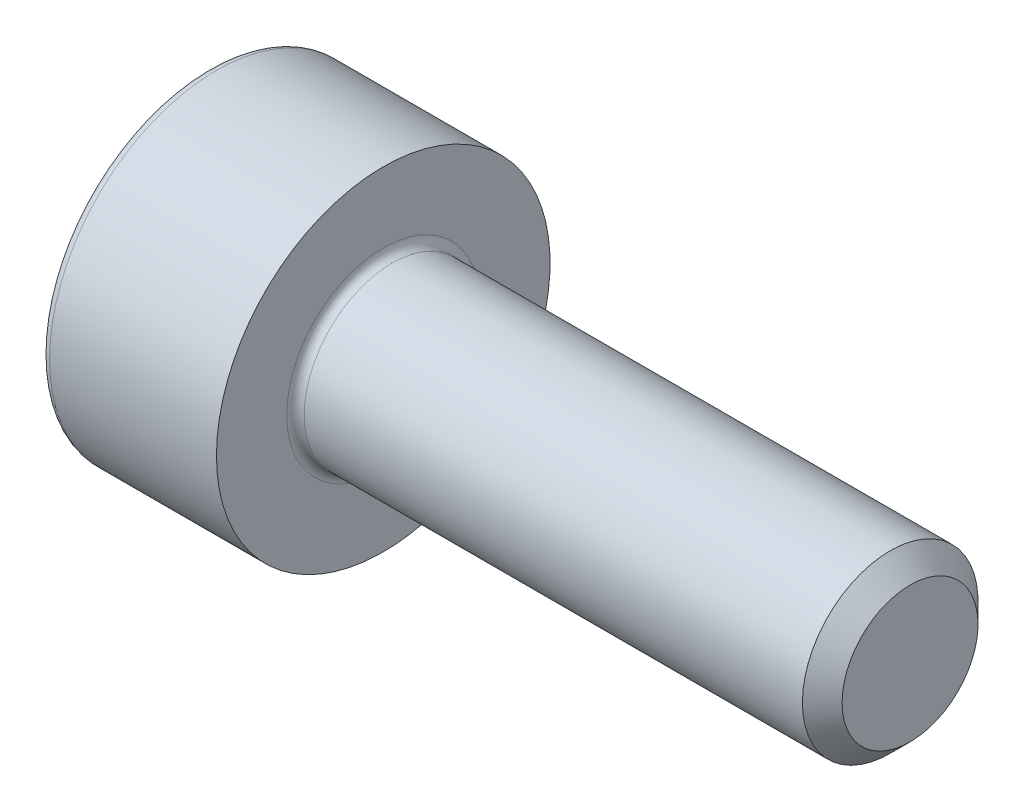
ISO-10303-21;
HEADER;
FILE_DESCRIPTION(('STEP AP214'),'2;1');
FILE_NAME('part.step','',(''),(''),'','','');
FILE_SCHEMA(('AUTOMOTIVE_DESIGN { 1 0 10303 214 1 1 1 1 }'));
ENDSEC;
DATA;
#1=APPLICATION_CONTEXT('core data for automotive mechanical design processes');
#2=APPLICATION_PROTOCOL_DEFINITION('international standard','automotive_design',2000,#1);
#3=PRODUCT_CONTEXT('',#1,'mechanical');
#4=PRODUCT('Part','Part','',(#3));
#5=PRODUCT_RELATED_PRODUCT_CATEGORY('part','',(#4));
#6=PRODUCT_DEFINITION_FORMATION('','',#4);
#7=PRODUCT_DEFINITION_CONTEXT('part definition',#1,'design');
#8=PRODUCT_DEFINITION('design','',#6,#7);
#9=PRODUCT_DEFINITION_SHAPE('','',#8);
#10=(LENGTH_UNIT() NAMED_UNIT(*) SI_UNIT(.MILLI.,.METRE.));
#11=(NAMED_UNIT(*) PLANE_ANGLE_UNIT() SI_UNIT($,.RADIAN.));
#12=(NAMED_UNIT(*) SI_UNIT($,.STERADIAN.) SOLID_ANGLE_UNIT());
#13=UNCERTAINTY_MEASURE_WITH_UNIT(LENGTH_MEASURE(1.E-05),#10,'distance_accuracy_value','');
#14=(GEOMETRIC_REPRESENTATION_CONTEXT(3) GLOBAL_UNCERTAINTY_ASSIGNED_CONTEXT((#13)) GLOBAL_UNIT_ASSIGNED_CONTEXT((#10,
#11,#12)) REPRESENTATION_CONTEXT('',''));
#15=CARTESIAN_POINT('',(0.,0.,0.));
#16=DIRECTION('',(0.,0.,1.));
#17=DIRECTION('',(1.,0.,0.));
#18=AXIS2_PLACEMENT_3D('',#15,#16,#17);
#19=CARTESIAN_POINT('',(0.,0.,0.));
#20=DIRECTION('',(-1.,0.,0.));
#21=DIRECTION('',(0.,0.,1.));
#22=AXIS2_PLACEMENT_3D('',#19,#20,#21);
#23=PLANE('',#22);
#24=DIRECTION('',(0.,-0.499999999999998,0.86602540378444));
#25=VECTOR('',#24,1.);
#26=CARTESIAN_POINT('',(0.,0.892006165897969,0.));
#27=LINE('',#26,#25);
#28=CARTESIAN_POINT('',(0.,0.892006165897969,0.));
#29=VERTEX_POINT('',#28);
#30=CARTESIAN_POINT('',(0.,0.446003082948984,0.772499999999997));
#31=VERTEX_POINT('',#30);
#32=EDGE_CURVE('E261',#29,#31,#27,.T.);
#33=ORIENTED_EDGE('',*,*,#32,.T.);
#34=DIRECTION('',(0.,1.,0.));
#35=VECTOR('',#34,1.);
#36=CARTESIAN_POINT('',(0.,-0.446003082948988,0.772499999999997));
#37=LINE('',#36,#35);
#38=CARTESIAN_POINT('',(0.,-0.446003082948988,0.772499999999997));
#39=VERTEX_POINT('',#38);
#40=EDGE_CURVE('E122',#39,#31,#37,.T.);
#41=ORIENTED_EDGE('',*,*,#40,.F.);
#42=DIRECTION('',(0.,-0.500000000000001,-0.866025403784438));
#43=VECTOR('',#42,1.);
#44=CARTESIAN_POINT('',(0.,-0.446003082948988,0.772499999999997));
#45=LINE('',#44,#43);
#46=CARTESIAN_POINT('',(0.,-0.892006165897974,0.));
#47=VERTEX_POINT('',#46);
#48=EDGE_CURVE('E264',#39,#47,#45,.T.);
#49=ORIENTED_EDGE('',*,*,#48,.T.);
#50=DIRECTION('',(0.,0.499999999999998,-0.86602540378444));
#51=VECTOR('',#50,1.);
#52=CARTESIAN_POINT('',(0.,-0.892006165897974,0.));
#53=LINE('',#52,#51);
#54=CARTESIAN_POINT('',(0.,-0.44600308294899,-0.772500000000003));
#55=VERTEX_POINT('',#54);
#56=EDGE_CURVE('E267',#47,#55,#53,.T.);
#57=ORIENTED_EDGE('',*,*,#56,.T.);
#58=DIRECTION('',(0.,-1.,0.));
#59=VECTOR('',#58,1.);
#60=CARTESIAN_POINT('',(0.,0.446003082948982,-0.772500000000004));
#61=LINE('',#60,#59);
#62=CARTESIAN_POINT('',(0.,0.446003082948982,-0.772500000000004));
#63=VERTEX_POINT('',#62);
#64=EDGE_CURVE('E270',#63,#55,#61,.T.);
#65=ORIENTED_EDGE('',*,*,#64,.F.);
#66=DIRECTION('',(0.,-0.500000000000001,-0.866025403784438));
#67=VECTOR('',#66,1.);
#68=CARTESIAN_POINT('',(0.,0.892006165897969,0.));
#69=LINE('',#68,#67);
#70=EDGE_CURVE('E117',#29,#63,#69,.T.);
#71=ORIENTED_EDGE('',*,*,#70,.F.);
#72=EDGE_LOOP('',(#33,#41,#49,#57,#65,#71));
#73=FACE_BOUND('',#72,.T.);
#74=CARTESIAN_POINT('',(0.,0.,0.));
#75=DIRECTION('',(-1.,0.,0.));
#76=DIRECTION('',(0.,0.,1.));
#77=AXIS2_PLACEMENT_3D('',#74,#75,#76);
#78=CIRCLE('',#77,1.8);
#79=CARTESIAN_POINT('',(0.,0.,1.8));
#80=VERTEX_POINT('',#79);
#81=EDGE_CURVE('E38',#80,#80,#78,.T.);
#82=ORIENTED_EDGE('',*,*,#81,.T.);
#83=EDGE_LOOP('',(#82));
#84=FACE_BOUND('',#83,.T.);
#85=ADVANCED_FACE('F30',(#73,#84),#23,.T.);
#86=CARTESIAN_POINT('',(-31.75,0.,0.));
#87=DIRECTION('',(-1.,0.,0.));
#88=DIRECTION('',(0.,0.,1.));
#89=AXIS2_PLACEMENT_3D('',#86,#87,#88);
#90=CYLINDRICAL_SURFACE('',#89,1.9);
#91=CARTESIAN_POINT('',(0.100000000000003,0.,0.));
#92=DIRECTION('',(-1.,0.,0.));
#93=DIRECTION('',(0.,0.,1.));
#94=AXIS2_PLACEMENT_3D('',#91,#92,#93);
#95=CIRCLE('',#94,1.9);
#96=CARTESIAN_POINT('',(0.100000000000003,0.,1.9));
#97=VERTEX_POINT('',#96);
#98=EDGE_CURVE('E11',#97,#97,#95,.F.);
#99=ORIENTED_EDGE('',*,*,#98,.T.);
#100=EDGE_LOOP('',(#99));
#101=FACE_BOUND('',#100,.T.);
#102=CARTESIAN_POINT('',(2.,0.,0.));
#103=DIRECTION('',(-1.,0.,0.));
#104=DIRECTION('',(0.,0.,1.));
#105=AXIS2_PLACEMENT_3D('',#102,#103,#104);
#106=CIRCLE('',#105,1.9);
#107=CARTESIAN_POINT('',(2.,0.,1.9));
#108=VERTEX_POINT('',#107);
#109=EDGE_CURVE('E140',#108,#108,#106,.T.);
#110=ORIENTED_EDGE('',*,*,#109,.T.);
#111=EDGE_LOOP('',(#110));
#112=FACE_BOUND('',#111,.T.);
#113=ADVANCED_FACE('F164',(#101,#112),#90,.T.);
#114=CARTESIAN_POINT('',(2.,1.9,0.));
#115=DIRECTION('',(1.,0.,0.));
#116=DIRECTION('',(0.,0.,-1.));
#117=AXIS2_PLACEMENT_3D('',#114,#115,#116);
#118=PLANE('',#117);
#119=CARTESIAN_POINT('',(2.,0.,0.));
#120=DIRECTION('',(1.,0.,0.));
#121=DIRECTION('',(0.,0.,-1.));
#122=AXIS2_PLACEMENT_3D('',#119,#120,#121);
#123=CIRCLE('',#122,1.1);
#124=CARTESIAN_POINT('',(2.,0.,-1.1));
#125=VERTEX_POINT('',#124);
#126=EDGE_CURVE('E143',#125,#125,#123,.F.);
#127=ORIENTED_EDGE('',*,*,#126,.T.);
#128=EDGE_LOOP('',(#127));
#129=FACE_BOUND('',#128,.T.);
#130=ORIENTED_EDGE('',*,*,#109,.F.);
#131=EDGE_LOOP('',(#130));
#132=FACE_BOUND('',#131,.T.);
#133=ADVANCED_FACE('F170',(#129,#132),#118,.T.);
#134=CARTESIAN_POINT('',(-31.75,0.,0.));
#135=DIRECTION('',(-1.,0.,0.));
#136=DIRECTION('',(0.,0.,1.));
#137=AXIS2_PLACEMENT_3D('',#134,#135,#136);
#138=CYLINDRICAL_SURFACE('',#137,1.);
#139=CARTESIAN_POINT('',(2.1,0.,0.));
#140=DIRECTION('',(1.,0.,0.));
#141=DIRECTION('',(0.,0.,-1.));
#142=AXIS2_PLACEMENT_3D('',#139,#140,#141);
#143=CIRCLE('',#142,1.);
#144=CARTESIAN_POINT('',(2.1,0.,-1.));
#145=VERTEX_POINT('',#144);
#146=EDGE_CURVE('E146',#145,#145,#143,.T.);
#147=ORIENTED_EDGE('',*,*,#146,.T.);
#148=EDGE_LOOP('',(#147));
#149=FACE_BOUND('',#148,.T.);
#150=CARTESIAN_POINT('',(7.77400000000003,0.,0.));
#151=DIRECTION('',(-1.,0.,0.));
#152=DIRECTION('',(0.,0.,1.));
#153=AXIS2_PLACEMENT_3D('',#150,#151,#152);
#154=CIRCLE('',#153,1.);
#155=CARTESIAN_POINT('',(7.77400000000003,0.,1.));
#156=VERTEX_POINT('',#155);
#157=EDGE_CURVE('E137',#156,#156,#154,.T.);
#158=ORIENTED_EDGE('',*,*,#157,.T.);
#159=EDGE_LOOP('',(#158));
#160=FACE_BOUND('',#159,.T.);
#161=ADVANCED_FACE('F176',(#149,#160),#138,.T.);
#162=CARTESIAN_POINT('',(8.00000000000001,0.,0.));
#163=DIRECTION('',(-1.,0.,0.));
#164=DIRECTION('',(0.,0.,1.));
#165=AXIS2_PLACEMENT_3D('',#162,#163,#164);
#166=CONICAL_SURFACE('',#165,0.774,0.785398163397502);
#167=ORIENTED_EDGE('',*,*,#157,.F.);
#168=EDGE_LOOP('',(#167));
#169=FACE_BOUND('',#168,.T.);
#170=CARTESIAN_POINT('',(8.00000000000001,0.,0.));
#171=DIRECTION('',(-1.,0.,0.));
#172=DIRECTION('',(0.,0.,1.));
#173=AXIS2_PLACEMENT_3D('',#170,#171,#172);
#174=CIRCLE('',#173,0.774);
#175=CARTESIAN_POINT('',(8.00000000000001,0.,0.774));
#176=VERTEX_POINT('',#175);
#177=EDGE_CURVE('E133',#176,#176,#174,.T.);
#178=ORIENTED_EDGE('',*,*,#177,.T.);
#179=EDGE_LOOP('',(#178));
#180=FACE_BOUND('',#179,.T.);
#181=ADVANCED_FACE('F180',(#169,#180),#166,.T.);
#182=CARTESIAN_POINT('',(8.00000000000001,0.774,0.));
#183=DIRECTION('',(1.,0.,0.));
#184=DIRECTION('',(0.,0.,-1.));
#185=AXIS2_PLACEMENT_3D('',#182,#183,#184);
#186=PLANE('',#185);
#187=ORIENTED_EDGE('',*,*,#177,.F.);
#188=EDGE_LOOP('',(#187));
#189=FACE_BOUND('',#188,.T.);
#190=ADVANCED_FACE('F160',(#189),#186,.T.);
#191=CARTESIAN_POINT('',(2.1,0.,0.));
#192=DIRECTION('',(1.,0.,0.));
#193=DIRECTION('',(0.,0.,-1.));
#194=AXIS2_PLACEMENT_3D('',#191,#192,#193);
#195=TOROIDAL_SURFACE('',#194,1.1,0.1);
#196=ORIENTED_EDGE('',*,*,#146,.F.);
#197=EDGE_LOOP('',(#196));
#198=FACE_BOUND('',#197,.T.);
#199=ORIENTED_EDGE('',*,*,#126,.F.);
#200=EDGE_LOOP('',(#199));
#201=FACE_BOUND('',#200,.T.);
#202=ADVANCED_FACE('F153',(#198,#201),#195,.F.);
#203=CARTESIAN_POINT('',(0.100000000000003,0.,0.));
#204=DIRECTION('',(-1.,0.,0.));
#205=DIRECTION('',(0.,0.,1.));
#206=AXIS2_PLACEMENT_3D('',#203,#204,#205);
#207=TOROIDAL_SURFACE('',#206,1.8,0.1);
#208=ORIENTED_EDGE('',*,*,#98,.F.);
#209=EDGE_LOOP('',(#208));
#210=FACE_BOUND('',#209,.T.);
#211=ORIENTED_EDGE('',*,*,#81,.F.);
#212=EDGE_LOOP('',(#211));
#213=FACE_BOUND('',#212,.T.);
#214=ADVANCED_FACE('F32',(#210,#213),#207,.T.);
#215=CARTESIAN_POINT('',(1.,0.892006165897969,0.));
#216=DIRECTION('',(0.,-0.86602540378444,-0.499999999999998));
#217=DIRECTION('',(0.,0.499999999999998,-0.86602540378444));
#218=AXIS2_PLACEMENT_3D('',#215,#216,#217);
#219=PLANE('',#218);
#220=ORIENTED_EDGE('',*,*,#32,.F.);
#221=DIRECTION('',(-1.,0.,0.));
#222=VECTOR('',#221,1.);
#223=CARTESIAN_POINT('',(1.,0.892006165897969,0.));
#224=LINE('',#223,#222);
#225=CARTESIAN_POINT('',(1.,0.892006165897969,0.));
#226=VERTEX_POINT('',#225);
#227=EDGE_CURVE('E260',#226,#29,#224,.T.);
#228=ORIENTED_EDGE('',*,*,#227,.F.);
#229=DIRECTION('',(0.,-0.499999999999998,0.86602540378444));
#230=VECTOR('',#229,1.);
#231=CARTESIAN_POINT('',(1.,0.892006165897969,0.));
#232=LINE('',#231,#230);
#233=CARTESIAN_POINT('',(1.,0.66900462442348,0.386249999999999));
#234=VERTEX_POINT('',#233);
#235=EDGE_CURVE('E45',#226,#234,#232,.T.);
#236=ORIENTED_EDGE('',*,*,#235,.T.);
#237=CARTESIAN_POINT('',(1.,0.446003082948984,0.772499999999997));
#238=VERTEX_POINT('',#237);
#239=EDGE_CURVE('E103',#234,#238,#232,.T.);
#240=ORIENTED_EDGE('',*,*,#239,.T.);
#241=DIRECTION('',(-1.,0.,0.));
#242=VECTOR('',#241,1.);
#243=CARTESIAN_POINT('',(1.,0.446003082948984,0.772499999999997));
#244=LINE('',#243,#242);
#245=EDGE_CURVE('E115',#238,#31,#244,.T.);
#246=ORIENTED_EDGE('',*,*,#245,.T.);
#247=EDGE_LOOP('',(#220,#228,#236,#240,#246));
#248=FACE_BOUND('',#247,.T.);
#249=ADVANCED_FACE('F114',(#248),#219,.T.);
#250=CARTESIAN_POINT('',(1.,-0.446003082948988,0.772499999999997));
#251=DIRECTION('',(0.,0.,1.));
#252=DIRECTION('',(0.,-1.,0.));
#253=AXIS2_PLACEMENT_3D('',#250,#251,#252);
#254=PLANE('',#253);
#255=ORIENTED_EDGE('',*,*,#40,.T.);
#256=ORIENTED_EDGE('',*,*,#245,.F.);
#257=DIRECTION('',(0.,1.,0.));
#258=VECTOR('',#257,1.);
#259=CARTESIAN_POINT('',(1.,-0.446003082948988,0.772499999999997));
#260=LINE('',#259,#258);
#261=CARTESIAN_POINT('',(1.,0.,0.772499999999997));
#262=VERTEX_POINT('',#261);
#263=EDGE_CURVE('E101',#262,#238,#260,.T.);
#264=ORIENTED_EDGE('',*,*,#263,.F.);
#265=CARTESIAN_POINT('',(1.,-0.446003082948988,0.772499999999997));
#266=VERTEX_POINT('',#265);
#267=EDGE_CURVE('E111',#266,#262,#260,.T.);
#268=ORIENTED_EDGE('',*,*,#267,.F.);
#269=DIRECTION('',(-1.,0.,0.));
#270=VECTOR('',#269,1.);
#271=CARTESIAN_POINT('',(1.,-0.446003082948988,0.772499999999997));
#272=LINE('',#271,#270);
#273=EDGE_CURVE('E124',#266,#39,#272,.T.);
#274=ORIENTED_EDGE('',*,*,#273,.T.);
#275=EDGE_LOOP('',(#255,#256,#264,#268,#274));
#276=FACE_BOUND('',#275,.T.);
#277=ADVANCED_FACE('F119',(#276),#254,.F.);
#278=CARTESIAN_POINT('',(1.,-0.446003082948988,0.772499999999997));
#279=DIRECTION('',(0.,0.866025403784438,-0.500000000000001));
#280=DIRECTION('',(0.,0.500000000000001,0.866025403784438));
#281=AXIS2_PLACEMENT_3D('',#278,#279,#280);
#282=PLANE('',#281);
#283=ORIENTED_EDGE('',*,*,#48,.F.);
#284=ORIENTED_EDGE('',*,*,#273,.F.);
#285=DIRECTION('',(0.,-0.500000000000001,-0.866025403784438));
#286=VECTOR('',#285,1.);
#287=CARTESIAN_POINT('',(1.,-0.446003082948988,0.772499999999997));
#288=LINE('',#287,#286);
#289=CARTESIAN_POINT('',(1.,-0.669004624423479,0.386250000000001));
#290=VERTEX_POINT('',#289);
#291=EDGE_CURVE('E241',#266,#290,#288,.T.);
#292=ORIENTED_EDGE('',*,*,#291,.T.);
#293=CARTESIAN_POINT('',(1.,-0.892006165897974,0.));
#294=VERTEX_POINT('',#293);
#295=EDGE_CURVE('E243',#290,#294,#288,.T.);
#296=ORIENTED_EDGE('',*,*,#295,.T.);
#297=DIRECTION('',(-1.,0.,0.));
#298=VECTOR('',#297,1.);
#299=CARTESIAN_POINT('',(1.,-0.892006165897974,0.));
#300=LINE('',#299,#298);
#301=EDGE_CURVE('E129',#294,#47,#300,.T.);
#302=ORIENTED_EDGE('',*,*,#301,.T.);
#303=EDGE_LOOP('',(#283,#284,#292,#296,#302));
#304=FACE_BOUND('',#303,.T.);
#305=ADVANCED_FACE('F193',(#304),#282,.T.);
#306=CARTESIAN_POINT('',(1.,-0.892006165897974,0.));
#307=DIRECTION('',(0.,0.86602540378444,0.499999999999998));
#308=DIRECTION('',(0.,-0.499999999999998,0.86602540378444));
#309=AXIS2_PLACEMENT_3D('',#306,#307,#308);
#310=PLANE('',#309);
#311=ORIENTED_EDGE('',*,*,#56,.F.);
#312=ORIENTED_EDGE('',*,*,#301,.F.);
#313=DIRECTION('',(0.,0.499999999999998,-0.86602540378444));
#314=VECTOR('',#313,1.);
#315=CARTESIAN_POINT('',(1.,-0.892006165897974,0.));
#316=LINE('',#315,#314);
#317=CARTESIAN_POINT('',(1.,-0.669004624423483,-0.386250000000001));
#318=VERTEX_POINT('',#317);
#319=EDGE_CURVE('E246',#294,#318,#316,.T.);
#320=ORIENTED_EDGE('',*,*,#319,.T.);
#321=CARTESIAN_POINT('',(1.,-0.44600308294899,-0.772500000000003));
#322=VERTEX_POINT('',#321);
#323=EDGE_CURVE('E250',#318,#322,#316,.T.);
#324=ORIENTED_EDGE('',*,*,#323,.T.);
#325=DIRECTION('',(-1.,0.,0.));
#326=VECTOR('',#325,1.);
#327=CARTESIAN_POINT('',(1.,-0.44600308294899,-0.772500000000003));
#328=LINE('',#327,#326);
#329=EDGE_CURVE('E279',#322,#55,#328,.T.);
#330=ORIENTED_EDGE('',*,*,#329,.T.);
#331=EDGE_LOOP('',(#311,#312,#320,#324,#330));
#332=FACE_BOUND('',#331,.T.);
#333=ADVANCED_FACE('F196',(#332),#310,.T.);
#334=CARTESIAN_POINT('',(1.,0.446003082948982,-0.772500000000004));
#335=DIRECTION('',(0.,0.,-1.));
#336=DIRECTION('',(0.,1.,0.));
#337=AXIS2_PLACEMENT_3D('',#334,#335,#336);
#338=PLANE('',#337);
#339=ORIENTED_EDGE('',*,*,#64,.T.);
#340=ORIENTED_EDGE('',*,*,#329,.F.);
#341=DIRECTION('',(0.,-1.,0.));
#342=VECTOR('',#341,1.);
#343=CARTESIAN_POINT('',(1.,0.446003082948982,-0.772500000000004));
#344=LINE('',#343,#342);
#345=CARTESIAN_POINT('',(1.,0.,-0.772500000000003));
#346=VERTEX_POINT('',#345);
#347=EDGE_CURVE('E254',#346,#322,#344,.T.);
#348=ORIENTED_EDGE('',*,*,#347,.F.);
#349=CARTESIAN_POINT('',(1.,0.446003082948982,-0.772500000000004));
#350=VERTEX_POINT('',#349);
#351=EDGE_CURVE('E255',#350,#346,#344,.T.);
#352=ORIENTED_EDGE('',*,*,#351,.F.);
#353=DIRECTION('',(-1.,0.,0.));
#354=VECTOR('',#353,1.);
#355=CARTESIAN_POINT('',(1.,0.446003082948982,-0.772500000000004));
#356=LINE('',#355,#354);
#357=EDGE_CURVE('E276',#350,#63,#356,.T.);
#358=ORIENTED_EDGE('',*,*,#357,.T.);
#359=EDGE_LOOP('',(#339,#340,#348,#352,#358));
#360=FACE_BOUND('',#359,.T.);
#361=ADVANCED_FACE('F200',(#360),#338,.F.);
#362=CARTESIAN_POINT('',(1.,0.892006165897969,0.));
#363=DIRECTION('',(0.,0.866025403784438,-0.500000000000001));
#364=DIRECTION('',(0.,0.500000000000001,0.866025403784438));
#365=AXIS2_PLACEMENT_3D('',#362,#363,#364);
#366=PLANE('',#365);
#367=ORIENTED_EDGE('',*,*,#70,.T.);
#368=ORIENTED_EDGE('',*,*,#357,.F.);
#369=DIRECTION('',(0.,-0.500000000000001,-0.866025403784438));
#370=VECTOR('',#369,1.);
#371=CARTESIAN_POINT('',(1.,0.892006165897969,0.));
#372=LINE('',#371,#370);
#373=CARTESIAN_POINT('',(1.,0.669004624423477,-0.38625));
#374=VERTEX_POINT('',#373);
#375=EDGE_CURVE('E258',#374,#350,#372,.T.);
#376=ORIENTED_EDGE('',*,*,#375,.F.);
#377=EDGE_CURVE('E232',#226,#374,#372,.T.);
#378=ORIENTED_EDGE('',*,*,#377,.F.);
#379=ORIENTED_EDGE('',*,*,#227,.T.);
#380=EDGE_LOOP('',(#367,#368,#376,#378,#379));
#381=FACE_BOUND('',#380,.T.);
#382=ADVANCED_FACE('F204',(#381),#366,.F.);
#383=CARTESIAN_POINT('',(1.,0.446003082948984,0.772499999999997));
#384=DIRECTION('',(-1.,0.,0.));
#385=DIRECTION('',(0.,0.,1.));
#386=AXIS2_PLACEMENT_3D('',#383,#384,#385);
#387=PLANE('',#386);
#388=CARTESIAN_POINT('',(1.,0.,0.));
#389=DIRECTION('',(-1.,0.,0.));
#390=DIRECTION('',(0.,0.,1.));
#391=AXIS2_PLACEMENT_3D('',#388,#389,#390);
#392=CIRCLE('',#391,0.772500000000001);
#393=EDGE_CURVE('E123',#290,#262,#392,.T.);
#394=ORIENTED_EDGE('',*,*,#393,.F.);
#395=ORIENTED_EDGE('',*,*,#291,.F.);
#396=ORIENTED_EDGE('',*,*,#267,.T.);
#397=EDGE_LOOP('',(#394,#395,#396));
#398=FACE_BOUND('',#397,.T.);
#399=ADVANCED_FACE('F208',(#398),#387,.T.);
#400=EDGE_CURVE('E127',#318,#290,#392,.T.);
#401=ORIENTED_EDGE('',*,*,#400,.F.);
#402=ORIENTED_EDGE('',*,*,#319,.F.);
#403=ORIENTED_EDGE('',*,*,#295,.F.);
#404=EDGE_LOOP('',(#401,#402,#403));
#405=FACE_BOUND('',#404,.T.);
#406=ADVANCED_FACE('F211',(#405),#387,.T.);
#407=EDGE_CURVE('E285',#346,#318,#392,.T.);
#408=ORIENTED_EDGE('',*,*,#407,.F.);
#409=ORIENTED_EDGE('',*,*,#347,.T.);
#410=ORIENTED_EDGE('',*,*,#323,.F.);
#411=EDGE_LOOP('',(#408,#409,#410));
#412=FACE_BOUND('',#411,.T.);
#413=ADVANCED_FACE('F216',(#412),#387,.T.);
#414=EDGE_CURVE('E235',#374,#346,#392,.T.);
#415=ORIENTED_EDGE('',*,*,#414,.F.);
#416=ORIENTED_EDGE('',*,*,#375,.T.);
#417=ORIENTED_EDGE('',*,*,#351,.T.);
#418=EDGE_LOOP('',(#415,#416,#417));
#419=FACE_BOUND('',#418,.T.);
#420=ADVANCED_FACE('F223',(#419),#387,.T.);
#421=EDGE_CURVE('E134',#234,#374,#392,.T.);
#422=ORIENTED_EDGE('',*,*,#421,.F.);
#423=ORIENTED_EDGE('',*,*,#235,.F.);
#424=ORIENTED_EDGE('',*,*,#377,.T.);
#425=EDGE_LOOP('',(#422,#423,#424));
#426=FACE_BOUND('',#425,.T.);
#427=ADVANCED_FACE('F219',(#426),#387,.T.);
#428=EDGE_CURVE('E106',#262,#234,#392,.T.);
#429=ORIENTED_EDGE('',*,*,#428,.F.);
#430=ORIENTED_EDGE('',*,*,#263,.T.);
#431=ORIENTED_EDGE('',*,*,#239,.F.);
#432=EDGE_LOOP('',(#429,#430,#431));
#433=FACE_BOUND('',#432,.T.);
#434=ADVANCED_FACE('F102',(#433),#387,.T.);
#435=CARTESIAN_POINT('',(1.,0.,0.));
#436=DIRECTION('',(-1.,0.,0.));
#437=DIRECTION('',(0.,0.,1.));
#438=AXIS2_PLACEMENT_3D('',#435,#436,#437);
#439=CONICAL_SURFACE('',#438,0.772500000000001,1.04719755119659);
#440=CARTESIAN_POINT('',(1.446003082949,0.,0.));
#441=VERTEX_POINT('',#440);
#442=VERTEX_LOOP('',#441);
#443=FACE_BOUND('',#442,.T.);
#444=ORIENTED_EDGE('',*,*,#428,.T.);
#445=ORIENTED_EDGE('',*,*,#421,.T.);
#446=ORIENTED_EDGE('',*,*,#414,.T.);
#447=ORIENTED_EDGE('',*,*,#407,.T.);
#448=ORIENTED_EDGE('',*,*,#400,.T.);
#449=ORIENTED_EDGE('',*,*,#393,.T.);
#450=EDGE_LOOP('',(#444,#445,#446,#447,#448,#449));
#451=FACE_BOUND('',#450,.T.);
#452=ADVANCED_FACE('F188',(#443,#451),#439,.F.);
#453=CLOSED_SHELL('',(#85,#113,#133,#161,#181,#190,#202,#214,#249,#277,#305,#333,#361,#382,#399,
#406,#413,#420,#427,#434,#452));
#454=MANIFOLD_SOLID_BREP('B2',#453);
#455=ADVANCED_BREP_SHAPE_REPRESENTATION('',(#18,#454),#14);
#456=SHAPE_DEFINITION_REPRESENTATION(#9,#455);
ENDSEC;
END-ISO-10303-21;
